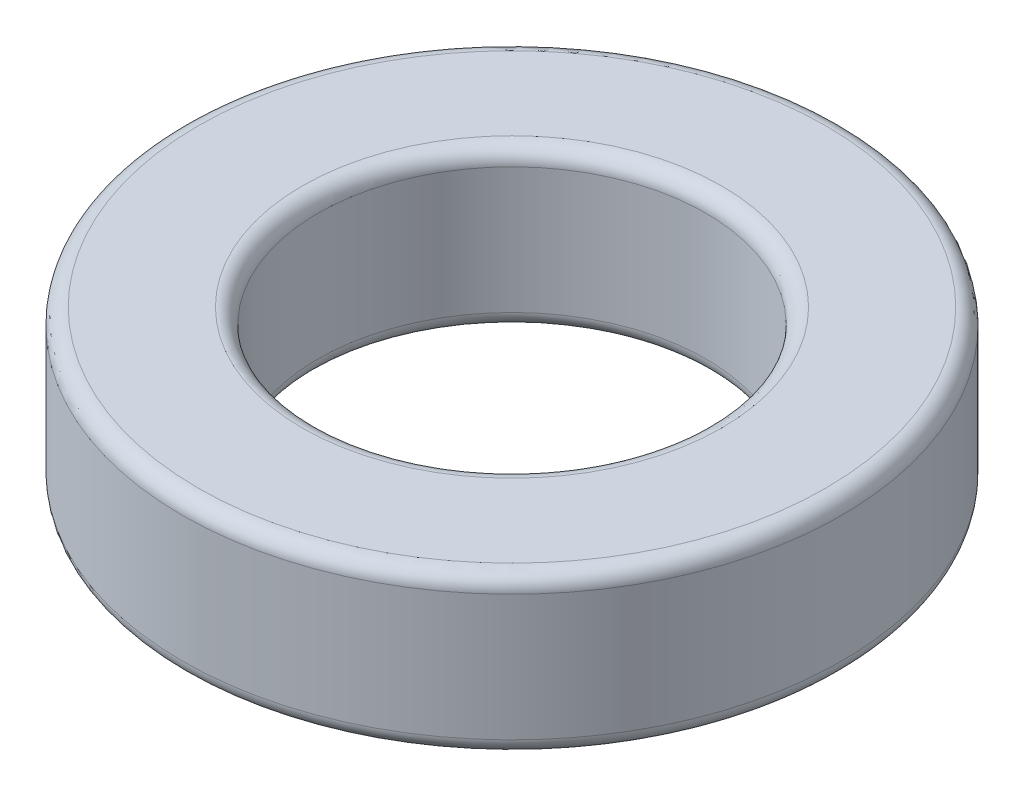
ISO-10303-21;
HEADER;
FILE_DESCRIPTION(('STEP AP214'),'2;1');
FILE_NAME('part.step','',(''),(''),'','','');
FILE_SCHEMA(('AUTOMOTIVE_DESIGN { 1 0 10303 214 1 1 1 1 }'));
ENDSEC;
DATA;
#1=APPLICATION_CONTEXT('core data for automotive mechanical design processes');
#2=APPLICATION_PROTOCOL_DEFINITION('international standard','automotive_design',2000,#1);
#3=PRODUCT_CONTEXT('',#1,'mechanical');
#4=PRODUCT('Part','Part','',(#3));
#5=PRODUCT_RELATED_PRODUCT_CATEGORY('part','',(#4));
#6=PRODUCT_DEFINITION_FORMATION('','',#4);
#7=PRODUCT_DEFINITION_CONTEXT('part definition',#1,'design');
#8=PRODUCT_DEFINITION('design','',#6,#7);
#9=PRODUCT_DEFINITION_SHAPE('','',#8);
#10=(LENGTH_UNIT() NAMED_UNIT(*) SI_UNIT(.MILLI.,.METRE.));
#11=(NAMED_UNIT(*) PLANE_ANGLE_UNIT() SI_UNIT($,.RADIAN.));
#12=(NAMED_UNIT(*) SI_UNIT($,.STERADIAN.) SOLID_ANGLE_UNIT());
#13=UNCERTAINTY_MEASURE_WITH_UNIT(LENGTH_MEASURE(1.E-05),#10,'distance_accuracy_value','');
#14=(GEOMETRIC_REPRESENTATION_CONTEXT(3) GLOBAL_UNCERTAINTY_ASSIGNED_CONTEXT((#13)) GLOBAL_UNIT_ASSIGNED_CONTEXT((#10,
#11,#12)) REPRESENTATION_CONTEXT('',''));
#15=CARTESIAN_POINT('',(0.,0.,0.));
#16=DIRECTION('',(0.,0.,1.));
#17=DIRECTION('',(1.,0.,0.));
#18=AXIS2_PLACEMENT_3D('',#15,#16,#17);
#19=CARTESIAN_POINT('',(0.,5.,0.));
#20=DIRECTION('',(0.,1.,0.));
#21=DIRECTION('',(0.,0.,1.));
#22=AXIS2_PLACEMENT_3D('',#19,#20,#21);
#23=PLANE('',#22);
#24=CARTESIAN_POINT('',(0.,5.,0.));
#25=DIRECTION('',(0.,1.,0.));
#26=DIRECTION('',(0.,0.,1.));
#27=AXIS2_PLACEMENT_3D('',#24,#25,#26);
#28=CIRCLE('',#27,6.65);
#29=CARTESIAN_POINT('',(0.,5.,6.65));
#30=VERTEX_POINT('',#29);
#31=EDGE_CURVE('E51',#30,#30,#28,.F.);
#32=ORIENTED_EDGE('',*,*,#31,.T.);
#33=EDGE_LOOP('',(#32));
#34=FACE_BOUND('',#33,.T.);
#35=CARTESIAN_POINT('',(0.,5.,0.));
#36=DIRECTION('',(0.,1.,0.));
#37=DIRECTION('',(0.,0.,1.));
#38=AXIS2_PLACEMENT_3D('',#35,#36,#37);
#39=CIRCLE('',#38,9.95);
#40=CARTESIAN_POINT('',(0.,5.,9.95));
#41=VERTEX_POINT('',#40);
#42=EDGE_CURVE('E54',#41,#41,#39,.T.);
#43=ORIENTED_EDGE('',*,*,#42,.T.);
#44=EDGE_LOOP('',(#43));
#45=FACE_BOUND('',#44,.T.);
#46=ADVANCED_FACE('F31',(#34,#45),#23,.T.);
#47=CARTESIAN_POINT('',(0.,0.,0.));
#48=DIRECTION('',(0.,1.,0.));
#49=DIRECTION('',(0.,0.,1.));
#50=AXIS2_PLACEMENT_3D('',#47,#48,#49);
#51=PLANE('',#50);
#52=CARTESIAN_POINT('',(0.,0.,0.));
#53=DIRECTION('',(0.,1.,0.));
#54=DIRECTION('',(0.,0.,1.));
#55=AXIS2_PLACEMENT_3D('',#52,#53,#54);
#56=CIRCLE('',#55,6.65);
#57=CARTESIAN_POINT('',(0.,0.,6.65));
#58=VERTEX_POINT('',#57);
#59=EDGE_CURVE('E10',#58,#58,#56,.T.);
#60=ORIENTED_EDGE('',*,*,#59,.T.);
#61=EDGE_LOOP('',(#60));
#62=FACE_BOUND('',#61,.T.);
#63=CARTESIAN_POINT('',(0.,0.,0.));
#64=DIRECTION('',(0.,1.,0.));
#65=DIRECTION('',(0.,0.,1.));
#66=AXIS2_PLACEMENT_3D('',#63,#64,#65);
#67=CIRCLE('',#66,9.95);
#68=CARTESIAN_POINT('',(0.,0.,9.95));
#69=VERTEX_POINT('',#68);
#70=EDGE_CURVE('E38',#69,#69,#67,.F.);
#71=ORIENTED_EDGE('',*,*,#70,.T.);
#72=EDGE_LOOP('',(#71));
#73=FACE_BOUND('',#72,.T.);
#74=ADVANCED_FACE('F79',(#62,#73),#51,.F.);
#75=CARTESIAN_POINT('',(0.,5.,0.));
#76=DIRECTION('',(0.,-1.,0.));
#77=DIRECTION('',(0.,0.,-1.));
#78=AXIS2_PLACEMENT_3D('',#75,#76,#77);
#79=CYLINDRICAL_SURFACE('',#78,10.45);
#80=CARTESIAN_POINT('',(0.,4.5,0.));
#81=DIRECTION('',(0.,1.,0.));
#82=DIRECTION('',(0.,0.,1.));
#83=AXIS2_PLACEMENT_3D('',#80,#81,#82);
#84=CIRCLE('',#83,10.45);
#85=CARTESIAN_POINT('',(0.,4.5,10.45));
#86=VERTEX_POINT('',#85);
#87=EDGE_CURVE('E42',#86,#86,#84,.F.);
#88=ORIENTED_EDGE('',*,*,#87,.T.);
#89=EDGE_LOOP('',(#88));
#90=FACE_BOUND('',#89,.T.);
#91=CARTESIAN_POINT('',(0.,0.5,0.));
#92=DIRECTION('',(0.,1.,0.));
#93=DIRECTION('',(0.,0.,1.));
#94=AXIS2_PLACEMENT_3D('',#91,#92,#93);
#95=CIRCLE('',#94,10.45);
#96=CARTESIAN_POINT('',(0.,0.5,10.45));
#97=VERTEX_POINT('',#96);
#98=EDGE_CURVE('E46',#97,#97,#95,.T.);
#99=ORIENTED_EDGE('',*,*,#98,.T.);
#100=EDGE_LOOP('',(#99));
#101=FACE_BOUND('',#100,.T.);
#102=ADVANCED_FACE('F85',(#90,#101),#79,.T.);
#103=CARTESIAN_POINT('',(0.,5.,0.));
#104=DIRECTION('',(0.,-1.,0.));
#105=DIRECTION('',(0.,0.,-1.));
#106=AXIS2_PLACEMENT_3D('',#103,#104,#105);
#107=CYLINDRICAL_SURFACE('',#106,6.15);
#108=CARTESIAN_POINT('',(0.,4.5,0.));
#109=DIRECTION('',(0.,1.,0.));
#110=DIRECTION('',(0.,0.,1.));
#111=AXIS2_PLACEMENT_3D('',#108,#109,#110);
#112=CIRCLE('',#111,6.15);
#113=CARTESIAN_POINT('',(0.,4.5,6.15));
#114=VERTEX_POINT('',#113);
#115=EDGE_CURVE('E57',#114,#114,#112,.T.);
#116=ORIENTED_EDGE('',*,*,#115,.T.);
#117=EDGE_LOOP('',(#116));
#118=FACE_BOUND('',#117,.T.);
#119=CARTESIAN_POINT('',(0.,0.5,0.));
#120=DIRECTION('',(0.,1.,0.));
#121=DIRECTION('',(0.,0.,1.));
#122=AXIS2_PLACEMENT_3D('',#119,#120,#121);
#123=CIRCLE('',#122,6.15);
#124=CARTESIAN_POINT('',(0.,0.5,6.15));
#125=VERTEX_POINT('',#124);
#126=EDGE_CURVE('E60',#125,#125,#123,.F.);
#127=ORIENTED_EDGE('',*,*,#126,.T.);
#128=EDGE_LOOP('',(#127));
#129=FACE_BOUND('',#128,.T.);
#130=ADVANCED_FACE('F64',(#118,#129),#107,.F.);
#131=CARTESIAN_POINT('',(0.,4.5,0.));
#132=DIRECTION('',(0.,1.,0.));
#133=DIRECTION('',(0.,0.,1.));
#134=AXIS2_PLACEMENT_3D('',#131,#132,#133);
#135=TOROIDAL_SURFACE('',#134,6.65,0.5);
#136=ORIENTED_EDGE('',*,*,#31,.F.);
#137=EDGE_LOOP('',(#136));
#138=FACE_BOUND('',#137,.T.);
#139=ORIENTED_EDGE('',*,*,#115,.F.);
#140=EDGE_LOOP('',(#139));
#141=FACE_BOUND('',#140,.T.);
#142=ADVANCED_FACE('F75',(#138,#141),#135,.T.);
#143=CARTESIAN_POINT('',(0.,4.5,0.));
#144=DIRECTION('',(0.,1.,0.));
#145=DIRECTION('',(0.,0.,1.));
#146=AXIS2_PLACEMENT_3D('',#143,#144,#145);
#147=TOROIDAL_SURFACE('',#146,9.95,0.5);
#148=ORIENTED_EDGE('',*,*,#87,.F.);
#149=EDGE_LOOP('',(#148));
#150=FACE_BOUND('',#149,.T.);
#151=ORIENTED_EDGE('',*,*,#42,.F.);
#152=EDGE_LOOP('',(#151));
#153=FACE_BOUND('',#152,.T.);
#154=ADVANCED_FACE('F69',(#150,#153),#147,.T.);
#155=CARTESIAN_POINT('',(0.,0.5,0.));
#156=DIRECTION('',(0.,1.,0.));
#157=DIRECTION('',(0.,0.,1.));
#158=AXIS2_PLACEMENT_3D('',#155,#156,#157);
#159=TOROIDAL_SURFACE('',#158,6.65,0.5);
#160=ORIENTED_EDGE('',*,*,#126,.F.);
#161=EDGE_LOOP('',(#160));
#162=FACE_BOUND('',#161,.T.);
#163=ORIENTED_EDGE('',*,*,#59,.F.);
#164=EDGE_LOOP('',(#163));
#165=FACE_BOUND('',#164,.T.);
#166=ADVANCED_FACE('F66',(#162,#165),#159,.T.);
#167=CARTESIAN_POINT('',(0.,0.5,0.));
#168=DIRECTION('',(0.,1.,0.));
#169=DIRECTION('',(0.,0.,1.));
#170=AXIS2_PLACEMENT_3D('',#167,#168,#169);
#171=TOROIDAL_SURFACE('',#170,9.95,0.5);
#172=ORIENTED_EDGE('',*,*,#70,.F.);
#173=EDGE_LOOP('',(#172));
#174=FACE_BOUND('',#173,.T.);
#175=ORIENTED_EDGE('',*,*,#98,.F.);
#176=EDGE_LOOP('',(#175));
#177=FACE_BOUND('',#176,.T.);
#178=ADVANCED_FACE('F33',(#174,#177),#171,.T.);
#179=CLOSED_SHELL('',(#46,#74,#102,#130,#142,#154,#166,#178));
#180=MANIFOLD_SOLID_BREP('B2',#179);
#181=ADVANCED_BREP_SHAPE_REPRESENTATION('',(#18,#180),#14);
#182=SHAPE_DEFINITION_REPRESENTATION(#9,#181);
ENDSEC;
END-ISO-10303-21;
